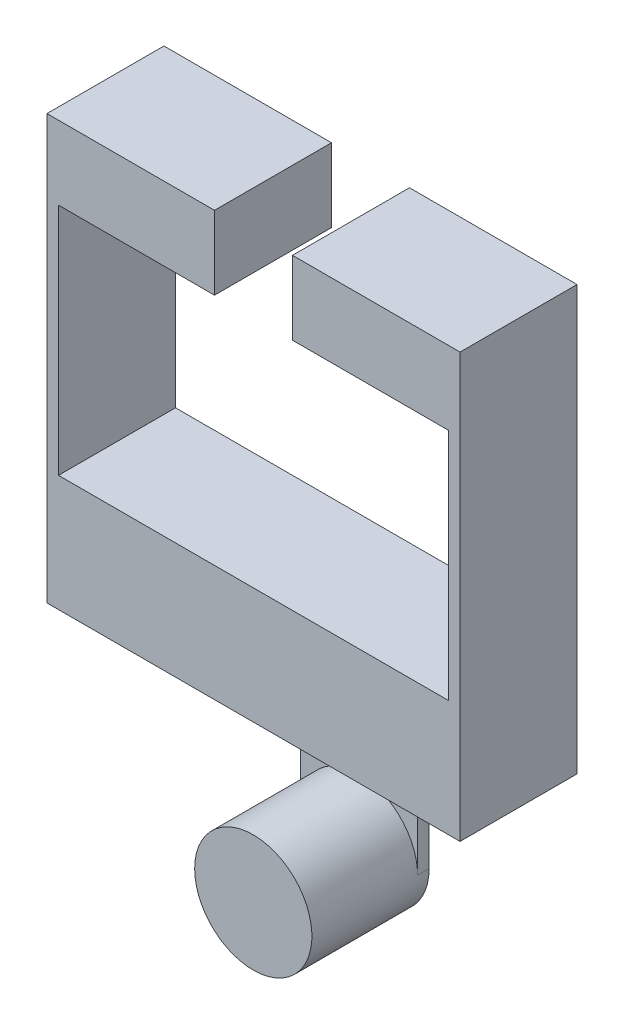
ISO-10303-21;
HEADER;
FILE_DESCRIPTION(('STEP AP214'),'2;1');
FILE_NAME('part.step','',(''),(''),'','','');
FILE_SCHEMA(('AUTOMOTIVE_DESIGN { 1 0 10303 214 1 1 1 1 }'));
ENDSEC;
DATA;
#1=APPLICATION_CONTEXT('core data for automotive mechanical design processes');
#2=APPLICATION_PROTOCOL_DEFINITION('international standard','automotive_design',2000,#1);
#3=PRODUCT_CONTEXT('',#1,'mechanical');
#4=PRODUCT('Part','Part','',(#3));
#5=PRODUCT_RELATED_PRODUCT_CATEGORY('part','',(#4));
#6=PRODUCT_DEFINITION_FORMATION('','',#4);
#7=PRODUCT_DEFINITION_CONTEXT('part definition',#1,'design');
#8=PRODUCT_DEFINITION('design','',#6,#7);
#9=PRODUCT_DEFINITION_SHAPE('','',#8);
#10=(LENGTH_UNIT() NAMED_UNIT(*) SI_UNIT(.MILLI.,.METRE.));
#11=(NAMED_UNIT(*) PLANE_ANGLE_UNIT() SI_UNIT($,.RADIAN.));
#12=(NAMED_UNIT(*) SI_UNIT($,.STERADIAN.) SOLID_ANGLE_UNIT());
#13=UNCERTAINTY_MEASURE_WITH_UNIT(LENGTH_MEASURE(1.E-05),#10,'distance_accuracy_value','');
#14=(GEOMETRIC_REPRESENTATION_CONTEXT(3) GLOBAL_UNCERTAINTY_ASSIGNED_CONTEXT((#13)) GLOBAL_UNIT_ASSIGNED_CONTEXT((#10,
#11,#12)) REPRESENTATION_CONTEXT('',''));
#15=CARTESIAN_POINT('',(0.,0.,0.));
#16=DIRECTION('',(0.,0.,1.));
#17=DIRECTION('',(1.,0.,0.));
#18=AXIS2_PLACEMENT_3D('',#15,#16,#17);
#19=CARTESIAN_POINT('',(33.6314814814815,34.5028585187953,19.05));
#20=DIRECTION('',(-1.,0.,0.));
#21=DIRECTION('',(0.,0.,1.));
#22=AXIS2_PLACEMENT_3D('',#19,#20,#21);
#23=PLANE('',#22);
#24=DIRECTION('',(0.,1.,0.));
#25=VECTOR('',#24,1.);
#26=CARTESIAN_POINT('',(33.6314814814815,34.5028585187953,0.));
#27=LINE('',#26,#25);
#28=CARTESIAN_POINT('',(33.6314814814815,-34.5028585187953,0.));
#29=VERTEX_POINT('',#28);
#30=CARTESIAN_POINT('',(33.6314814814815,34.5028585187953,0.));
#31=VERTEX_POINT('',#30);
#32=EDGE_CURVE('E166',#29,#31,#27,.T.);
#33=ORIENTED_EDGE('',*,*,#32,.T.);
#34=DIRECTION('',(0.,0.,-1.));
#35=VECTOR('',#34,1.);
#36=CARTESIAN_POINT('',(33.6314814814815,34.5028585187953,19.05));
#37=LINE('',#36,#35);
#38=CARTESIAN_POINT('',(33.6314814814815,34.5028585187953,19.05));
#39=VERTEX_POINT('',#38);
#40=EDGE_CURVE('E11',#39,#31,#37,.T.);
#41=ORIENTED_EDGE('',*,*,#40,.F.);
#42=DIRECTION('',(0.,1.,0.));
#43=VECTOR('',#42,1.);
#44=CARTESIAN_POINT('',(33.6314814814815,34.5028585187953,19.05));
#45=LINE('',#44,#43);
#46=CARTESIAN_POINT('',(33.6314814814815,-34.5028585187953,19.05));
#47=VERTEX_POINT('',#46);
#48=EDGE_CURVE('E210',#47,#39,#45,.T.);
#49=ORIENTED_EDGE('',*,*,#48,.F.);
#50=DIRECTION('',(0.,0.,-1.));
#51=VECTOR('',#50,1.);
#52=CARTESIAN_POINT('',(33.6314814814815,-34.5028585187953,19.05));
#53=LINE('',#52,#51);
#54=EDGE_CURVE('E248',#47,#29,#53,.T.);
#55=ORIENTED_EDGE('',*,*,#54,.T.);
#56=EDGE_LOOP('',(#33,#41,#49,#55));
#57=FACE_BOUND('',#56,.T.);
#58=ADVANCED_FACE('F44',(#57),#23,.F.);
#59=CARTESIAN_POINT('',(33.6314814814815,34.5028585187953,19.05));
#60=DIRECTION('',(0.,-1.,0.));
#61=DIRECTION('',(1.,0.,0.));
#62=AXIS2_PLACEMENT_3D('',#59,#60,#61);
#63=PLANE('',#62);
#64=DIRECTION('',(-1.,0.,0.));
#65=VECTOR('',#64,1.);
#66=CARTESIAN_POINT('',(33.6314814814815,34.5028585187953,0.));
#67=LINE('',#66,#65);
#68=CARTESIAN_POINT('',(6.35000000000001,34.5028585187952,0.));
#69=VERTEX_POINT('',#68);
#70=EDGE_CURVE('E252',#31,#69,#67,.T.);
#71=ORIENTED_EDGE('',*,*,#70,.T.);
#72=DIRECTION('',(0.,0.,-1.));
#73=VECTOR('',#72,1.);
#74=CARTESIAN_POINT('',(6.35000000000001,34.5028585187952,19.05));
#75=LINE('',#74,#73);
#76=CARTESIAN_POINT('',(6.35000000000001,34.5028585187952,19.05));
#77=VERTEX_POINT('',#76);
#78=EDGE_CURVE('E52',#77,#69,#75,.T.);
#79=ORIENTED_EDGE('',*,*,#78,.F.);
#80=DIRECTION('',(-1.,0.,0.));
#81=VECTOR('',#80,1.);
#82=CARTESIAN_POINT('',(33.6314814814815,34.5028585187953,19.05));
#83=LINE('',#82,#81);
#84=EDGE_CURVE('E214',#39,#77,#83,.T.);
#85=ORIENTED_EDGE('',*,*,#84,.F.);
#86=ORIENTED_EDGE('',*,*,#40,.T.);
#87=EDGE_LOOP('',(#71,#79,#85,#86));
#88=FACE_BOUND('',#87,.T.);
#89=ADVANCED_FACE('F349',(#88),#63,.F.);
#90=CARTESIAN_POINT('',(6.35000000000001,34.5028585187952,19.05));
#91=DIRECTION('',(1.,0.,0.));
#92=DIRECTION('',(0.,1.,0.));
#93=AXIS2_PLACEMENT_3D('',#90,#91,#92);
#94=PLANE('',#93);
#95=DIRECTION('',(0.,-1.,0.));
#96=VECTOR('',#95,1.);
#97=CARTESIAN_POINT('',(6.35000000000001,34.5028585187952,0.));
#98=LINE('',#97,#96);
#99=CARTESIAN_POINT('',(6.35000000000001,22.529183690703,0.));
#100=VERTEX_POINT('',#99);
#101=EDGE_CURVE('E255',#69,#100,#98,.T.);
#102=ORIENTED_EDGE('',*,*,#101,.T.);
#103=DIRECTION('',(0.,0.,-1.));
#104=VECTOR('',#103,1.);
#105=CARTESIAN_POINT('',(6.35000000000001,22.529183690703,19.05));
#106=LINE('',#105,#104);
#107=CARTESIAN_POINT('',(6.35000000000001,22.529183690703,19.05));
#108=VERTEX_POINT('',#107);
#109=EDGE_CURVE('E319',#108,#100,#106,.T.);
#110=ORIENTED_EDGE('',*,*,#109,.F.);
#111=DIRECTION('',(0.,-1.,0.));
#112=VECTOR('',#111,1.);
#113=CARTESIAN_POINT('',(6.35000000000001,34.5028585187952,19.05));
#114=LINE('',#113,#112);
#115=EDGE_CURVE('E218',#77,#108,#114,.T.);
#116=ORIENTED_EDGE('',*,*,#115,.F.);
#117=ORIENTED_EDGE('',*,*,#78,.T.);
#118=EDGE_LOOP('',(#102,#110,#116,#117));
#119=FACE_BOUND('',#118,.T.);
#120=ADVANCED_FACE('F329',(#119),#94,.F.);
#121=CARTESIAN_POINT('',(6.35000000000001,22.529183690703,19.05));
#122=DIRECTION('',(0.,1.,0.));
#123=DIRECTION('',(-1.,0.,0.));
#124=AXIS2_PLACEMENT_3D('',#121,#122,#123);
#125=PLANE('',#124);
#126=DIRECTION('',(1.,0.,0.));
#127=VECTOR('',#126,1.);
#128=CARTESIAN_POINT('',(6.35000000000001,22.529183690703,0.));
#129=LINE('',#128,#127);
#130=CARTESIAN_POINT('',(31.75,22.529183690703,0.));
#131=VERTEX_POINT('',#130);
#132=EDGE_CURVE('E258',#100,#131,#129,.T.);
#133=ORIENTED_EDGE('',*,*,#132,.T.);
#134=DIRECTION('',(0.,0.,-1.));
#135=VECTOR('',#134,1.);
#136=CARTESIAN_POINT('',(31.75,22.529183690703,19.05));
#137=LINE('',#136,#135);
#138=CARTESIAN_POINT('',(31.75,22.529183690703,19.05));
#139=VERTEX_POINT('',#138);
#140=EDGE_CURVE('E315',#139,#131,#137,.T.);
#141=ORIENTED_EDGE('',*,*,#140,.F.);
#142=DIRECTION('',(1.,0.,0.));
#143=VECTOR('',#142,1.);
#144=CARTESIAN_POINT('',(6.35000000000001,22.529183690703,19.05));
#145=LINE('',#144,#143);
#146=EDGE_CURVE('E221',#108,#139,#145,.T.);
#147=ORIENTED_EDGE('',*,*,#146,.F.);
#148=ORIENTED_EDGE('',*,*,#109,.T.);
#149=EDGE_LOOP('',(#133,#141,#147,#148));
#150=FACE_BOUND('',#149,.T.);
#151=ADVANCED_FACE('F337',(#150),#125,.F.);
#152=CARTESIAN_POINT('',(31.75,22.529183690703,19.05));
#153=DIRECTION('',(1.,0.,0.));
#154=DIRECTION('',(0.,1.,0.));
#155=AXIS2_PLACEMENT_3D('',#152,#153,#154);
#156=PLANE('',#155);
#157=DIRECTION('',(0.,-1.,0.));
#158=VECTOR('',#157,1.);
#159=CARTESIAN_POINT('',(31.75,22.529183690703,0.));
#160=LINE('',#159,#158);
#161=CARTESIAN_POINT('',(31.75,-15.570816309297,0.));
#162=VERTEX_POINT('',#161);
#163=EDGE_CURVE('E261',#131,#162,#160,.T.);
#164=ORIENTED_EDGE('',*,*,#163,.T.);
#165=DIRECTION('',(0.,0.,-1.));
#166=VECTOR('',#165,1.);
#167=CARTESIAN_POINT('',(31.75,-15.570816309297,19.05));
#168=LINE('',#167,#166);
#169=CARTESIAN_POINT('',(31.75,-15.570816309297,19.05));
#170=VERTEX_POINT('',#169);
#171=EDGE_CURVE('E311',#170,#162,#168,.T.);
#172=ORIENTED_EDGE('',*,*,#171,.F.);
#173=DIRECTION('',(0.,-1.,0.));
#174=VECTOR('',#173,1.);
#175=CARTESIAN_POINT('',(31.75,22.529183690703,19.05));
#176=LINE('',#175,#174);
#177=EDGE_CURVE('E224',#139,#170,#176,.T.);
#178=ORIENTED_EDGE('',*,*,#177,.F.);
#179=ORIENTED_EDGE('',*,*,#140,.T.);
#180=EDGE_LOOP('',(#164,#172,#178,#179));
#181=FACE_BOUND('',#180,.T.);
#182=ADVANCED_FACE('F341',(#181),#156,.F.);
#183=CARTESIAN_POINT('',(31.75,-15.570816309297,19.05));
#184=DIRECTION('',(0.,-1.,0.));
#185=DIRECTION('',(1.,0.,0.));
#186=AXIS2_PLACEMENT_3D('',#183,#184,#185);
#187=PLANE('',#186);
#188=DIRECTION('',(-1.,0.,0.));
#189=VECTOR('',#188,1.);
#190=CARTESIAN_POINT('',(31.75,-15.570816309297,0.));
#191=LINE('',#190,#189);
#192=CARTESIAN_POINT('',(-31.75,-15.570816309297,0.));
#193=VERTEX_POINT('',#192);
#194=EDGE_CURVE('E264',#162,#193,#191,.T.);
#195=ORIENTED_EDGE('',*,*,#194,.T.);
#196=DIRECTION('',(0.,0.,-1.));
#197=VECTOR('',#196,1.);
#198=CARTESIAN_POINT('',(-31.75,-15.570816309297,19.05));
#199=LINE('',#198,#197);
#200=CARTESIAN_POINT('',(-31.75,-15.570816309297,19.05));
#201=VERTEX_POINT('',#200);
#202=EDGE_CURVE('E307',#201,#193,#199,.T.);
#203=ORIENTED_EDGE('',*,*,#202,.F.);
#204=DIRECTION('',(-1.,0.,0.));
#205=VECTOR('',#204,1.);
#206=CARTESIAN_POINT('',(31.75,-15.570816309297,19.05));
#207=LINE('',#206,#205);
#208=EDGE_CURVE('E227',#170,#201,#207,.T.);
#209=ORIENTED_EDGE('',*,*,#208,.F.);
#210=ORIENTED_EDGE('',*,*,#171,.T.);
#211=EDGE_LOOP('',(#195,#203,#209,#210));
#212=FACE_BOUND('',#211,.T.);
#213=ADVANCED_FACE('F437',(#212),#187,.F.);
#214=CARTESIAN_POINT('',(-31.75,22.529183690703,19.05));
#215=DIRECTION('',(-1.,0.,0.));
#216=DIRECTION('',(0.,-1.,0.));
#217=AXIS2_PLACEMENT_3D('',#214,#215,#216);
#218=PLANE('',#217);
#219=DIRECTION('',(0.,1.,0.));
#220=VECTOR('',#219,1.);
#221=CARTESIAN_POINT('',(-31.75,22.529183690703,0.));
#222=LINE('',#221,#220);
#223=CARTESIAN_POINT('',(-31.75,22.529183690703,0.));
#224=VERTEX_POINT('',#223);
#225=EDGE_CURVE('E267',#193,#224,#222,.T.);
#226=ORIENTED_EDGE('',*,*,#225,.T.);
#227=DIRECTION('',(0.,0.,-1.));
#228=VECTOR('',#227,1.);
#229=CARTESIAN_POINT('',(-31.75,22.529183690703,19.05));
#230=LINE('',#229,#228);
#231=CARTESIAN_POINT('',(-31.75,22.529183690703,19.05));
#232=VERTEX_POINT('',#231);
#233=EDGE_CURVE('E303',#232,#224,#230,.T.);
#234=ORIENTED_EDGE('',*,*,#233,.F.);
#235=DIRECTION('',(0.,1.,0.));
#236=VECTOR('',#235,1.);
#237=CARTESIAN_POINT('',(-31.75,22.529183690703,19.05));
#238=LINE('',#237,#236);
#239=EDGE_CURVE('E230',#201,#232,#238,.T.);
#240=ORIENTED_EDGE('',*,*,#239,.F.);
#241=ORIENTED_EDGE('',*,*,#202,.T.);
#242=EDGE_LOOP('',(#226,#234,#240,#241));
#243=FACE_BOUND('',#242,.T.);
#244=ADVANCED_FACE('F440',(#243),#218,.F.);
#245=CARTESIAN_POINT('',(-6.35000000000001,22.529183690703,19.05));
#246=DIRECTION('',(0.,1.,0.));
#247=DIRECTION('',(-1.,0.,0.));
#248=AXIS2_PLACEMENT_3D('',#245,#246,#247);
#249=PLANE('',#248);
#250=DIRECTION('',(1.,0.,0.));
#251=VECTOR('',#250,1.);
#252=CARTESIAN_POINT('',(-6.35000000000001,22.529183690703,0.));
#253=LINE('',#252,#251);
#254=CARTESIAN_POINT('',(-6.35000000000001,22.529183690703,0.));
#255=VERTEX_POINT('',#254);
#256=EDGE_CURVE('E270',#224,#255,#253,.T.);
#257=ORIENTED_EDGE('',*,*,#256,.T.);
#258=DIRECTION('',(0.,0.,-1.));
#259=VECTOR('',#258,1.);
#260=CARTESIAN_POINT('',(-6.35000000000001,22.529183690703,19.05));
#261=LINE('',#260,#259);
#262=CARTESIAN_POINT('',(-6.35000000000001,22.529183690703,19.05));
#263=VERTEX_POINT('',#262);
#264=EDGE_CURVE('E299',#263,#255,#261,.T.);
#265=ORIENTED_EDGE('',*,*,#264,.F.);
#266=DIRECTION('',(1.,0.,0.));
#267=VECTOR('',#266,1.);
#268=CARTESIAN_POINT('',(-6.35000000000001,22.529183690703,19.05));
#269=LINE('',#268,#267);
#270=EDGE_CURVE('E233',#232,#263,#269,.T.);
#271=ORIENTED_EDGE('',*,*,#270,.F.);
#272=ORIENTED_EDGE('',*,*,#233,.T.);
#273=EDGE_LOOP('',(#257,#265,#271,#272));
#274=FACE_BOUND('',#273,.T.);
#275=ADVANCED_FACE('F444',(#274),#249,.F.);
#276=CARTESIAN_POINT('',(-6.35000000000001,34.5028585187952,19.05));
#277=DIRECTION('',(-1.,0.,0.));
#278=DIRECTION('',(0.,-1.,0.));
#279=AXIS2_PLACEMENT_3D('',#276,#277,#278);
#280=PLANE('',#279);
#281=DIRECTION('',(0.,1.,0.));
#282=VECTOR('',#281,1.);
#283=CARTESIAN_POINT('',(-6.35000000000001,34.5028585187952,0.));
#284=LINE('',#283,#282);
#285=CARTESIAN_POINT('',(-6.35000000000001,34.5028585187952,0.));
#286=VERTEX_POINT('',#285);
#287=EDGE_CURVE('E273',#255,#286,#284,.T.);
#288=ORIENTED_EDGE('',*,*,#287,.T.);
#289=DIRECTION('',(0.,0.,-1.));
#290=VECTOR('',#289,1.);
#291=CARTESIAN_POINT('',(-6.35000000000001,34.5028585187952,19.05));
#292=LINE('',#291,#290);
#293=CARTESIAN_POINT('',(-6.35000000000001,34.5028585187952,19.05));
#294=VERTEX_POINT('',#293);
#295=EDGE_CURVE('E295',#294,#286,#292,.T.);
#296=ORIENTED_EDGE('',*,*,#295,.F.);
#297=DIRECTION('',(0.,1.,0.));
#298=VECTOR('',#297,1.);
#299=CARTESIAN_POINT('',(-6.35000000000001,34.5028585187952,19.05));
#300=LINE('',#299,#298);
#301=EDGE_CURVE('E236',#263,#294,#300,.T.);
#302=ORIENTED_EDGE('',*,*,#301,.F.);
#303=ORIENTED_EDGE('',*,*,#264,.T.);
#304=EDGE_LOOP('',(#288,#296,#302,#303));
#305=FACE_BOUND('',#304,.T.);
#306=ADVANCED_FACE('F448',(#305),#280,.F.);
#307=CARTESIAN_POINT('',(-33.6314814814815,34.5028585187952,19.05));
#308=DIRECTION('',(0.,-1.,0.));
#309=DIRECTION('',(0.,0.,-1.));
#310=AXIS2_PLACEMENT_3D('',#307,#308,#309);
#311=PLANE('',#310);
#312=DIRECTION('',(-1.,0.,0.));
#313=VECTOR('',#312,1.);
#314=CARTESIAN_POINT('',(-33.6314814814815,34.5028585187952,0.));
#315=LINE('',#314,#313);
#316=CARTESIAN_POINT('',(-33.6314814814815,34.5028585187952,0.));
#317=VERTEX_POINT('',#316);
#318=EDGE_CURVE('E276',#286,#317,#315,.T.);
#319=ORIENTED_EDGE('',*,*,#318,.T.);
#320=DIRECTION('',(0.,0.,-1.));
#321=VECTOR('',#320,1.);
#322=CARTESIAN_POINT('',(-33.6314814814815,34.5028585187952,19.05));
#323=LINE('',#322,#321);
#324=CARTESIAN_POINT('',(-33.6314814814815,34.5028585187952,19.05));
#325=VERTEX_POINT('',#324);
#326=EDGE_CURVE('E291',#325,#317,#323,.T.);
#327=ORIENTED_EDGE('',*,*,#326,.F.);
#328=DIRECTION('',(-1.,0.,0.));
#329=VECTOR('',#328,1.);
#330=CARTESIAN_POINT('',(-33.6314814814815,34.5028585187952,19.05));
#331=LINE('',#330,#329);
#332=EDGE_CURVE('E239',#294,#325,#331,.T.);
#333=ORIENTED_EDGE('',*,*,#332,.F.);
#334=ORIENTED_EDGE('',*,*,#295,.T.);
#335=EDGE_LOOP('',(#319,#327,#333,#334));
#336=FACE_BOUND('',#335,.T.);
#337=ADVANCED_FACE('F452',(#336),#311,.F.);
#338=CARTESIAN_POINT('',(-33.6314814814815,34.5028585187952,19.05));
#339=DIRECTION('',(1.,0.,0.));
#340=DIRECTION('',(0.,0.,-1.));
#341=AXIS2_PLACEMENT_3D('',#338,#339,#340);
#342=PLANE('',#341);
#343=DIRECTION('',(0.,-1.,0.));
#344=VECTOR('',#343,1.);
#345=CARTESIAN_POINT('',(-33.6314814814815,34.5028585187952,0.));
#346=LINE('',#345,#344);
#347=CARTESIAN_POINT('',(-33.6314814814815,-34.5028585187952,0.));
#348=VERTEX_POINT('',#347);
#349=EDGE_CURVE('E279',#317,#348,#346,.T.);
#350=ORIENTED_EDGE('',*,*,#349,.T.);
#351=DIRECTION('',(0.,0.,-1.));
#352=VECTOR('',#351,1.);
#353=CARTESIAN_POINT('',(-33.6314814814815,-34.5028585187952,19.05));
#354=LINE('',#353,#352);
#355=CARTESIAN_POINT('',(-33.6314814814815,-34.5028585187952,19.05));
#356=VERTEX_POINT('',#355);
#357=EDGE_CURVE('E287',#356,#348,#354,.T.);
#358=ORIENTED_EDGE('',*,*,#357,.F.);
#359=DIRECTION('',(0.,-1.,0.));
#360=VECTOR('',#359,1.);
#361=CARTESIAN_POINT('',(-33.6314814814815,34.5028585187952,19.05));
#362=LINE('',#361,#360);
#363=EDGE_CURVE('E242',#325,#356,#362,.T.);
#364=ORIENTED_EDGE('',*,*,#363,.F.);
#365=ORIENTED_EDGE('',*,*,#326,.T.);
#366=EDGE_LOOP('',(#350,#358,#364,#365));
#367=FACE_BOUND('',#366,.T.);
#368=ADVANCED_FACE('F407',(#367),#342,.F.);
#369=CARTESIAN_POINT('',(-33.6314814814815,-34.5028585187952,19.05));
#370=DIRECTION('',(0.,1.,0.));
#371=DIRECTION('',(-1.,0.,0.));
#372=AXIS2_PLACEMENT_3D('',#369,#370,#371);
#373=PLANE('',#372);
#374=DIRECTION('',(1.,0.,0.));
#375=VECTOR('',#374,1.);
#376=CARTESIAN_POINT('',(-33.6314814814815,-34.5028585187952,0.));
#377=LINE('',#376,#375);
#378=CARTESIAN_POINT('',(-9.54406398512849,-34.5028585187952,0.));
#379=VERTEX_POINT('',#378);
#380=EDGE_CURVE('E215',#348,#379,#377,.T.);
#381=ORIENTED_EDGE('',*,*,#380,.T.);
#382=DIRECTION('',(0.,0.,1.));
#383=VECTOR('',#382,1.);
#384=CARTESIAN_POINT('',(-9.54406398512849,-34.5028585187953,0.));
#385=LINE('',#384,#383);
#386=CARTESIAN_POINT('',(-9.5440639851285,-34.5028585187953,1.87772327794906));
#387=VERTEX_POINT('',#386);
#388=EDGE_CURVE('E59',#379,#387,#385,.T.);
#389=ORIENTED_EDGE('',*,*,#388,.T.);
#390=DIRECTION('',(1.,0.,0.));
#391=VECTOR('',#390,1.);
#392=CARTESIAN_POINT('',(0.,-34.5028585187953,1.87772327794906));
#393=LINE('',#392,#391);
#394=CARTESIAN_POINT('',(9.54406398512849,-34.5028585187953,1.87772327794906));
#395=VERTEX_POINT('',#394);
#396=EDGE_CURVE('E198',#387,#395,#393,.T.);
#397=ORIENTED_EDGE('',*,*,#396,.T.);
#398=DIRECTION('',(0.,0.,1.));
#399=VECTOR('',#398,1.);
#400=CARTESIAN_POINT('',(9.54406398512849,-34.5028585187953,0.));
#401=LINE('',#400,#399);
#402=CARTESIAN_POINT('',(9.54406398512849,-34.5028585187953,0.));
#403=VERTEX_POINT('',#402);
#404=EDGE_CURVE('E65',#403,#395,#401,.T.);
#405=ORIENTED_EDGE('',*,*,#404,.F.);
#406=EDGE_CURVE('E163',#403,#29,#377,.T.);
#407=ORIENTED_EDGE('',*,*,#406,.T.);
#408=ORIENTED_EDGE('',*,*,#54,.F.);
#409=DIRECTION('',(1.,0.,0.));
#410=VECTOR('',#409,1.);
#411=CARTESIAN_POINT('',(-33.6314814814815,-34.5028585187952,19.05));
#412=LINE('',#411,#410);
#413=EDGE_CURVE('E245',#356,#47,#412,.T.);
#414=ORIENTED_EDGE('',*,*,#413,.F.);
#415=ORIENTED_EDGE('',*,*,#357,.T.);
#416=EDGE_LOOP('',(#381,#389,#397,#405,#407,#408,#414,#415));
#417=FACE_BOUND('',#416,.T.);
#418=ADVANCED_FACE('F353',(#417),#373,.F.);
#419=CARTESIAN_POINT('',(0.,0.,19.05));
#420=DIRECTION('',(0.,0.,1.));
#421=DIRECTION('',(1.,0.,0.));
#422=AXIS2_PLACEMENT_3D('',#419,#420,#421);
#423=PLANE('',#422);
#424=ORIENTED_EDGE('',*,*,#48,.T.);
#425=ORIENTED_EDGE('',*,*,#84,.T.);
#426=ORIENTED_EDGE('',*,*,#115,.T.);
#427=ORIENTED_EDGE('',*,*,#146,.T.);
#428=ORIENTED_EDGE('',*,*,#177,.T.);
#429=ORIENTED_EDGE('',*,*,#208,.T.);
#430=ORIENTED_EDGE('',*,*,#239,.T.);
#431=ORIENTED_EDGE('',*,*,#270,.T.);
#432=ORIENTED_EDGE('',*,*,#301,.T.);
#433=ORIENTED_EDGE('',*,*,#332,.T.);
#434=ORIENTED_EDGE('',*,*,#363,.T.);
#435=ORIENTED_EDGE('',*,*,#413,.T.);
#436=EDGE_LOOP('',(#424,#425,#426,#427,#428,#429,#430,#431,#432,#433,#434,#435));
#437=FACE_BOUND('',#436,.T.);
#438=ADVANCED_FACE('F345',(#437),#423,.T.);
#439=CARTESIAN_POINT('',(0.,0.,0.));
#440=DIRECTION('',(0.,0.,1.));
#441=DIRECTION('',(1.,0.,0.));
#442=AXIS2_PLACEMENT_3D('',#439,#440,#441);
#443=PLANE('',#442);
#444=DIRECTION('',(0.,1.,0.));
#445=VECTOR('',#444,1.);
#446=CARTESIAN_POINT('',(9.54406398512849,-59.9028585187952,0.));
#447=LINE('',#446,#445);
#448=CARTESIAN_POINT('',(9.5440639851285,-59.9028585187952,0.));
#449=VERTEX_POINT('',#448);
#450=EDGE_CURVE('E156',#449,#403,#447,.T.);
#451=ORIENTED_EDGE('',*,*,#450,.F.);
#452=CARTESIAN_POINT('',(0.,-59.9028585187952,0.));
#453=DIRECTION('',(0.,0.,-1.));
#454=DIRECTION('',(-1.,0.,0.));
#455=AXIS2_PLACEMENT_3D('',#452,#453,#454);
#456=CIRCLE('',#455,9.5440639851285);
#457=CARTESIAN_POINT('',(-9.5440639851285,-59.9028585187952,0.));
#458=VERTEX_POINT('',#457);
#459=EDGE_CURVE('E161',#449,#458,#456,.T.);
#460=ORIENTED_EDGE('',*,*,#459,.T.);
#461=DIRECTION('',(0.,1.,0.));
#462=VECTOR('',#461,1.);
#463=CARTESIAN_POINT('',(-9.5440639851285,-59.9028585187952,0.));
#464=LINE('',#463,#462);
#465=EDGE_CURVE('E195',#458,#379,#464,.T.);
#466=ORIENTED_EDGE('',*,*,#465,.T.);
#467=ORIENTED_EDGE('',*,*,#380,.F.);
#468=ORIENTED_EDGE('',*,*,#349,.F.);
#469=ORIENTED_EDGE('',*,*,#318,.F.);
#470=ORIENTED_EDGE('',*,*,#287,.F.);
#471=ORIENTED_EDGE('',*,*,#256,.F.);
#472=ORIENTED_EDGE('',*,*,#225,.F.);
#473=ORIENTED_EDGE('',*,*,#194,.F.);
#474=ORIENTED_EDGE('',*,*,#163,.F.);
#475=ORIENTED_EDGE('',*,*,#132,.F.);
#476=ORIENTED_EDGE('',*,*,#101,.F.);
#477=ORIENTED_EDGE('',*,*,#70,.F.);
#478=ORIENTED_EDGE('',*,*,#32,.F.);
#479=ORIENTED_EDGE('',*,*,#406,.F.);
#480=EDGE_LOOP('',(#451,#460,#466,#467,#468,#469,#470,#471,#472,#473,#474,#475,#476,#477,#478,#479));
#481=FACE_BOUND('',#480,.T.);
#482=ADVANCED_FACE('F158',(#481),#443,.F.);
#483=CARTESIAN_POINT('',(9.54406398512849,-59.9028585187952,0.));
#484=DIRECTION('',(-1.,0.,0.));
#485=DIRECTION('',(0.,0.,1.));
#486=AXIS2_PLACEMENT_3D('',#483,#484,#485);
#487=PLANE('',#486);
#488=ORIENTED_EDGE('',*,*,#404,.T.);
#489=DIRECTION('',(0.,1.,0.));
#490=VECTOR('',#489,1.);
#491=CARTESIAN_POINT('',(9.54406398512849,-59.9028585187952,1.87772327794906));
#492=LINE('',#491,#490);
#493=CARTESIAN_POINT('',(9.54406398512849,-59.9028585187952,1.87772327794906));
#494=VERTEX_POINT('',#493);
#495=EDGE_CURVE('E167',#494,#395,#492,.T.);
#496=ORIENTED_EDGE('',*,*,#495,.F.);
#497=DIRECTION('',(0.,0.,1.));
#498=VECTOR('',#497,1.);
#499=CARTESIAN_POINT('',(9.54406398512849,-59.9028585187952,0.));
#500=LINE('',#499,#498);
#501=EDGE_CURVE('E171',#449,#494,#500,.T.);
#502=ORIENTED_EDGE('',*,*,#501,.F.);
#503=ORIENTED_EDGE('',*,*,#450,.T.);
#504=EDGE_LOOP('',(#488,#496,#502,#503));
#505=FACE_BOUND('',#504,.T.);
#506=ADVANCED_FACE('F172',(#505),#487,.F.);
#507=CARTESIAN_POINT('',(0.,-59.9028585187952,1.87772327794906));
#508=DIRECTION('',(0.,0.,1.));
#509=DIRECTION('',(1.,0.,0.));
#510=AXIS2_PLACEMENT_3D('',#507,#508,#509);
#511=PLANE('',#510);
#512=CARTESIAN_POINT('',(0.,-59.9028585187952,1.87772327794906));
#513=DIRECTION('',(0.,0.,1.));
#514=DIRECTION('',(1.,0.,0.));
#515=AXIS2_PLACEMENT_3D('',#512,#513,#514);
#516=CIRCLE('',#515,9.5440639851285);
#517=CARTESIAN_POINT('',(-9.5440639851285,-59.9028585187952,1.87772327794906));
#518=VERTEX_POINT('',#517);
#519=EDGE_CURVE('E188',#494,#518,#516,.T.);
#520=ORIENTED_EDGE('',*,*,#519,.F.);
#521=ORIENTED_EDGE('',*,*,#495,.T.);
#522=ORIENTED_EDGE('',*,*,#396,.F.);
#523=DIRECTION('',(0.,1.,0.));
#524=VECTOR('',#523,1.);
#525=CARTESIAN_POINT('',(-9.5440639851285,-59.9028585187952,1.87772327794906));
#526=LINE('',#525,#524);
#527=EDGE_CURVE('E205',#518,#387,#526,.T.);
#528=ORIENTED_EDGE('',*,*,#527,.F.);
#529=EDGE_LOOP('',(#520,#521,#522,#528));
#530=FACE_BOUND('',#529,.T.);
#531=ADVANCED_FACE('F415',(#530),#511,.T.);
#532=CARTESIAN_POINT('',(-9.5440639851285,-59.9028585187952,0.));
#533=DIRECTION('',(-1.,0.,0.));
#534=DIRECTION('',(0.,0.,1.));
#535=AXIS2_PLACEMENT_3D('',#532,#533,#534);
#536=PLANE('',#535);
#537=ORIENTED_EDGE('',*,*,#388,.F.);
#538=ORIENTED_EDGE('',*,*,#465,.F.);
#539=DIRECTION('',(0.,0.,1.));
#540=VECTOR('',#539,1.);
#541=CARTESIAN_POINT('',(-9.5440639851285,-59.9028585187952,0.));
#542=LINE('',#541,#540);
#543=EDGE_CURVE('E177',#458,#518,#542,.T.);
#544=ORIENTED_EDGE('',*,*,#543,.T.);
#545=ORIENTED_EDGE('',*,*,#527,.T.);
#546=EDGE_LOOP('',(#537,#538,#544,#545));
#547=FACE_BOUND('',#546,.T.);
#548=ADVANCED_FACE('F412',(#547),#536,.T.);
#549=CARTESIAN_POINT('',(0.,-59.9028585187952,19.088127970257));
#550=DIRECTION('',(0.,0.,-1.));
#551=DIRECTION('',(-1.,0.,0.));
#552=AXIS2_PLACEMENT_3D('',#549,#550,#551);
#553=CYLINDRICAL_SURFACE('',#552,9.5440639851285);
#554=CARTESIAN_POINT('',(0.,-59.9028585187952,19.088127970257));
#555=DIRECTION('',(0.,0.,-1.));
#556=DIRECTION('',(-1.,0.,0.));
#557=AXIS2_PLACEMENT_3D('',#554,#555,#556);
#558=CIRCLE('',#557,9.5440639851285);
#559=CARTESIAN_POINT('',(-9.5440639851285,-59.9028585187952,19.088127970257));
#560=VERTEX_POINT('',#559);
#561=EDGE_CURVE('E183',#560,#560,#558,.T.);
#562=ORIENTED_EDGE('',*,*,#561,.T.);
#563=EDGE_LOOP('',(#562));
#564=FACE_BOUND('',#563,.T.);
#565=ORIENTED_EDGE('',*,*,#519,.T.);
#566=ORIENTED_EDGE('',*,*,#543,.F.);
#567=ORIENTED_EDGE('',*,*,#459,.F.);
#568=ORIENTED_EDGE('',*,*,#501,.T.);
#569=EDGE_LOOP('',(#565,#566,#567,#568));
#570=FACE_BOUND('',#569,.T.);
#571=ADVANCED_FACE('F180',(#564,#570),#553,.T.);
#572=CARTESIAN_POINT('',(0.,0.,19.088127970257));
#573=DIRECTION('',(0.,0.,-1.));
#574=DIRECTION('',(-1.,0.,0.));
#575=AXIS2_PLACEMENT_3D('',#572,#573,#574);
#576=PLANE('',#575);
#577=ORIENTED_EDGE('',*,*,#561,.F.);
#578=EDGE_LOOP('',(#577));
#579=FACE_BOUND('',#578,.T.);
#580=ADVANCED_FACE('F501',(#579),#576,.F.);
#581=CLOSED_SHELL('',(#58,#89,#120,#151,#182,#213,#244,#275,#306,#337,#368,#418,#438,#482,#506,
#531,#548,#571,#580));
#582=MANIFOLD_SOLID_BREP('B2',#581);
#583=ADVANCED_BREP_SHAPE_REPRESENTATION('',(#18,#582),#14);
#584=SHAPE_DEFINITION_REPRESENTATION(#9,#583);
ENDSEC;
END-ISO-10303-21;
